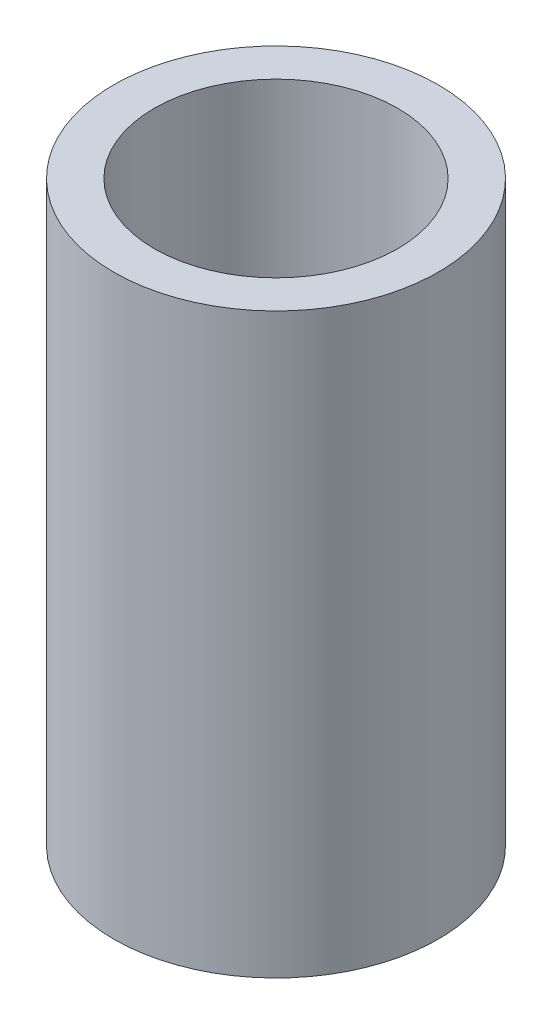
ISO-10303-21;
HEADER;
FILE_DESCRIPTION(('STEP AP214'),'2;1');
FILE_NAME('part.step','',(''),(''),'','','');
FILE_SCHEMA(('AUTOMOTIVE_DESIGN { 1 0 10303 214 1 1 1 1 }'));
ENDSEC;
DATA;
#1=APPLICATION_CONTEXT('core data for automotive mechanical design processes');
#2=APPLICATION_PROTOCOL_DEFINITION('international standard','automotive_design',2000,#1);
#3=PRODUCT_CONTEXT('',#1,'mechanical');
#4=PRODUCT('Part','Part','',(#3));
#5=PRODUCT_RELATED_PRODUCT_CATEGORY('part','',(#4));
#6=PRODUCT_DEFINITION_FORMATION('','',#4);
#7=PRODUCT_DEFINITION_CONTEXT('part definition',#1,'design');
#8=PRODUCT_DEFINITION('design','',#6,#7);
#9=PRODUCT_DEFINITION_SHAPE('','',#8);
#10=(LENGTH_UNIT() NAMED_UNIT(*) SI_UNIT(.MILLI.,.METRE.));
#11=(NAMED_UNIT(*) PLANE_ANGLE_UNIT() SI_UNIT($,.RADIAN.));
#12=(NAMED_UNIT(*) SI_UNIT($,.STERADIAN.) SOLID_ANGLE_UNIT());
#13=UNCERTAINTY_MEASURE_WITH_UNIT(LENGTH_MEASURE(1.E-05),#10,'distance_accuracy_value','');
#14=(GEOMETRIC_REPRESENTATION_CONTEXT(3) GLOBAL_UNCERTAINTY_ASSIGNED_CONTEXT((#13)) GLOBAL_UNIT_ASSIGNED_CONTEXT((#10,
#11,#12)) REPRESENTATION_CONTEXT('',''));
#15=CARTESIAN_POINT('',(0.,0.,0.));
#16=DIRECTION('',(0.,0.,1.));
#17=DIRECTION('',(1.,0.,0.));
#18=AXIS2_PLACEMENT_3D('',#15,#16,#17);
#19=CARTESIAN_POINT('',(0.,28.4770000436831,0.));
#20=DIRECTION('',(0.,1.,0.));
#21=DIRECTION('',(0.,0.,1.));
#22=AXIS2_PLACEMENT_3D('',#19,#20,#21);
#23=PLANE('',#22);
#24=CARTESIAN_POINT('',(0.,28.4770000436831,0.));
#25=DIRECTION('',(0.,1.,0.));
#26=DIRECTION('',(0.,0.,1.));
#27=AXIS2_PLACEMENT_3D('',#24,#25,#26);
#28=CIRCLE('',#27,8.);
#29=CARTESIAN_POINT('',(0.,28.4770000436831,8.));
#30=VERTEX_POINT('',#29);
#31=EDGE_CURVE('E10',#30,#30,#28,.T.);
#32=ORIENTED_EDGE('',*,*,#31,.T.);
#33=EDGE_LOOP('',(#32));
#34=FACE_BOUND('',#33,.T.);
#35=CARTESIAN_POINT('',(0.,28.4770000436831,0.));
#36=DIRECTION('',(0.,1.,0.));
#37=DIRECTION('',(0.,0.,1.));
#38=AXIS2_PLACEMENT_3D('',#35,#36,#37);
#39=CIRCLE('',#38,6.);
#40=CARTESIAN_POINT('',(0.,28.4770000436831,6.));
#41=VERTEX_POINT('',#40);
#42=EDGE_CURVE('E50',#41,#41,#39,.T.);
#43=ORIENTED_EDGE('',*,*,#42,.F.);
#44=EDGE_LOOP('',(#43));
#45=FACE_BOUND('',#44,.T.);
#46=ADVANCED_FACE('F39',(#34,#45),#23,.T.);
#47=CARTESIAN_POINT('',(0.,0.,0.));
#48=DIRECTION('',(0.,1.,0.));
#49=DIRECTION('',(0.,0.,1.));
#50=AXIS2_PLACEMENT_3D('',#47,#48,#49);
#51=PLANE('',#50);
#52=CARTESIAN_POINT('',(0.,0.,0.));
#53=DIRECTION('',(0.,1.,0.));
#54=DIRECTION('',(0.,0.,1.));
#55=AXIS2_PLACEMENT_3D('',#52,#53,#54);
#56=CIRCLE('',#55,8.);
#57=CARTESIAN_POINT('',(0.,0.,8.));
#58=VERTEX_POINT('',#57);
#59=EDGE_CURVE('E43',#58,#58,#56,.T.);
#60=ORIENTED_EDGE('',*,*,#59,.F.);
#61=EDGE_LOOP('',(#60));
#62=FACE_BOUND('',#61,.T.);
#63=CARTESIAN_POINT('',(0.,0.,0.));
#64=DIRECTION('',(0.,1.,0.));
#65=DIRECTION('',(0.,0.,1.));
#66=AXIS2_PLACEMENT_3D('',#63,#64,#65);
#67=CIRCLE('',#66,6.);
#68=CARTESIAN_POINT('',(0.,0.,6.));
#69=VERTEX_POINT('',#68);
#70=EDGE_CURVE('E52',#69,#69,#67,.T.);
#71=ORIENTED_EDGE('',*,*,#70,.T.);
#72=EDGE_LOOP('',(#71));
#73=FACE_BOUND('',#72,.T.);
#74=ADVANCED_FACE('F62',(#62,#73),#51,.F.);
#75=CARTESIAN_POINT('',(0.,28.4770000436831,0.));
#76=DIRECTION('',(0.,-1.,0.));
#77=DIRECTION('',(0.,0.,-1.));
#78=AXIS2_PLACEMENT_3D('',#75,#76,#77);
#79=CYLINDRICAL_SURFACE('',#78,8.);
#80=ORIENTED_EDGE('',*,*,#31,.F.);
#81=EDGE_LOOP('',(#80));
#82=FACE_BOUND('',#81,.T.);
#83=ORIENTED_EDGE('',*,*,#59,.T.);
#84=EDGE_LOOP('',(#83));
#85=FACE_BOUND('',#84,.T.);
#86=ADVANCED_FACE('F41',(#82,#85),#79,.T.);
#87=CARTESIAN_POINT('',(0.,28.4770000436831,0.));
#88=DIRECTION('',(0.,-1.,0.));
#89=DIRECTION('',(0.,0.,-1.));
#90=AXIS2_PLACEMENT_3D('',#87,#88,#89);
#91=CYLINDRICAL_SURFACE('',#90,6.);
#92=ORIENTED_EDGE('',*,*,#42,.T.);
#93=EDGE_LOOP('',(#92));
#94=FACE_BOUND('',#93,.T.);
#95=ORIENTED_EDGE('',*,*,#70,.F.);
#96=EDGE_LOOP('',(#95));
#97=FACE_BOUND('',#96,.T.);
#98=ADVANCED_FACE('F58',(#94,#97),#91,.F.);
#99=CLOSED_SHELL('',(#46,#74,#86,#98));
#100=MANIFOLD_SOLID_BREP('B2',#99);
#101=ADVANCED_BREP_SHAPE_REPRESENTATION('',(#18,#100),#14);
#102=SHAPE_DEFINITION_REPRESENTATION(#9,#101);
ENDSEC;
END-ISO-10303-21;
